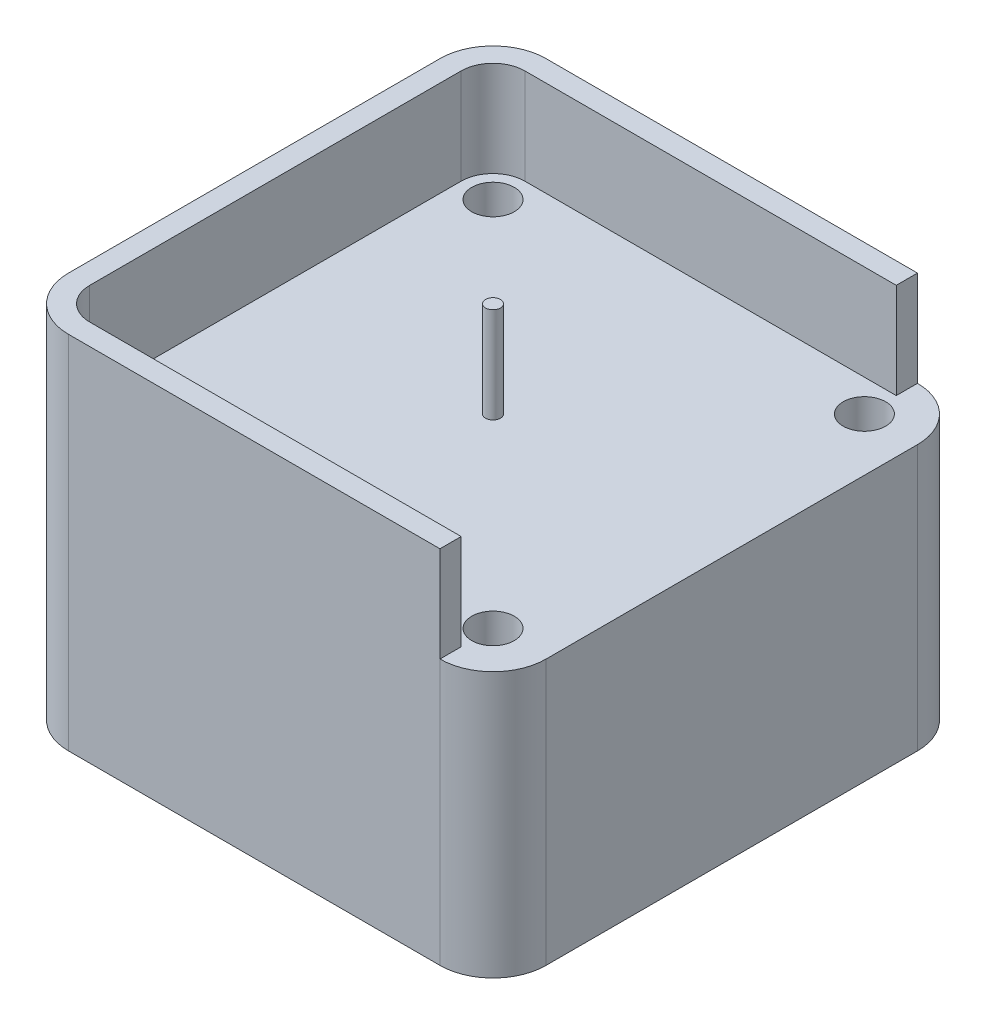
ISO-10303-21;
HEADER;
FILE_DESCRIPTION(('STEP AP214'),'2;1');
FILE_NAME('part.step','',(''),(''),'','','');
FILE_SCHEMA(('AUTOMOTIVE_DESIGN { 1 0 10303 214 1 1 1 1 }'));
ENDSEC;
DATA;
#1=APPLICATION_CONTEXT('core data for automotive mechanical design processes');
#2=APPLICATION_PROTOCOL_DEFINITION('international standard','automotive_design',2000,#1);
#3=PRODUCT_CONTEXT('',#1,'mechanical');
#4=PRODUCT('Part','Part','',(#3));
#5=PRODUCT_RELATED_PRODUCT_CATEGORY('part','',(#4));
#6=PRODUCT_DEFINITION_FORMATION('','',#4);
#7=PRODUCT_DEFINITION_CONTEXT('part definition',#1,'design');
#8=PRODUCT_DEFINITION('design','',#6,#7);
#9=PRODUCT_DEFINITION_SHAPE('','',#8);
#10=(LENGTH_UNIT() NAMED_UNIT(*) SI_UNIT(.MILLI.,.METRE.));
#11=(NAMED_UNIT(*) PLANE_ANGLE_UNIT() SI_UNIT($,.RADIAN.));
#12=(NAMED_UNIT(*) SI_UNIT($,.STERADIAN.) SOLID_ANGLE_UNIT());
#13=UNCERTAINTY_MEASURE_WITH_UNIT(LENGTH_MEASURE(1.E-05),#10,'distance_accuracy_value','');
#14=(GEOMETRIC_REPRESENTATION_CONTEXT(3) GLOBAL_UNCERTAINTY_ASSIGNED_CONTEXT((#13)) GLOBAL_UNIT_ASSIGNED_CONTEXT((#10,
#11,#12)) REPRESENTATION_CONTEXT('',''));
#15=CARTESIAN_POINT('',(0.,0.,0.));
#16=DIRECTION('',(0.,0.,1.));
#17=DIRECTION('',(1.,0.,0.));
#18=AXIS2_PLACEMENT_3D('',#15,#16,#17);
#19=CARTESIAN_POINT('',(16.1102106969206,50.,-43.2414910858995));
#20=DIRECTION('',(0.,-1.,0.));
#21=DIRECTION('',(0.,0.,-1.));
#22=AXIS2_PLACEMENT_3D('',#19,#20,#21);
#23=CYLINDRICAL_SURFACE('',#22,10.);
#24=CARTESIAN_POINT('',(16.1102106969206,50.,-43.2414910858995));
#25=DIRECTION('',(0.,1.,0.));
#26=DIRECTION('',(0.,0.,1.));
#27=AXIS2_PLACEMENT_3D('',#24,#25,#26);
#28=CIRCLE('',#27,10.);
#29=CARTESIAN_POINT('',(26.1102106969206,50.,-43.2414910858994));
#30=VERTEX_POINT('',#29);
#31=CARTESIAN_POINT('',(16.1102106969206,50.,-53.2414910858995));
#32=VERTEX_POINT('',#31);
#33=EDGE_CURVE('E198',#30,#32,#28,.T.);
#34=ORIENTED_EDGE('',*,*,#33,.F.);
#35=DIRECTION('',(0.,-1.,0.));
#36=VECTOR('',#35,1.);
#37=CARTESIAN_POINT('',(26.1102106969206,50.,-43.2414910858994));
#38=LINE('',#37,#36);
#39=CARTESIAN_POINT('',(26.1102106969206,0.,-43.2414910858994));
#40=VERTEX_POINT('',#39);
#41=EDGE_CURVE('E105',#30,#40,#38,.T.);
#42=ORIENTED_EDGE('',*,*,#41,.T.);
#43=CARTESIAN_POINT('',(16.1102106969206,0.,-43.2414910858995));
#44=DIRECTION('',(0.,1.,0.));
#45=DIRECTION('',(0.,0.,-1.));
#46=AXIS2_PLACEMENT_3D('',#43,#44,#45);
#47=CIRCLE('',#46,10.);
#48=CARTESIAN_POINT('',(16.1102106969205,0.,-53.2414910858995));
#49=VERTEX_POINT('',#48);
#50=EDGE_CURVE('E222',#40,#49,#47,.T.);
#51=ORIENTED_EDGE('',*,*,#50,.T.);
#52=DIRECTION('',(0.,-1.,0.));
#53=VECTOR('',#52,1.);
#54=CARTESIAN_POINT('',(16.1102106969205,50.,-53.2414910858995));
#55=LINE('',#54,#53);
#56=EDGE_CURVE('E220',#32,#49,#55,.T.);
#57=ORIENTED_EDGE('',*,*,#56,.F.);
#58=EDGE_LOOP('',(#34,#42,#51,#57));
#59=FACE_BOUND('',#58,.T.);
#60=ADVANCED_FACE('F90',(#59),#23,.T.);
#61=CARTESIAN_POINT('',(16.1102106969206,50.,26.7585089141005));
#62=DIRECTION('',(0.,-1.,0.));
#63=DIRECTION('',(0.,0.,-1.));
#64=AXIS2_PLACEMENT_3D('',#61,#62,#63);
#65=CYLINDRICAL_SURFACE('',#64,10.);
#66=CARTESIAN_POINT('',(16.1102106969206,50.,26.7585089141005));
#67=DIRECTION('',(0.,1.,0.));
#68=DIRECTION('',(0.,0.,1.));
#69=AXIS2_PLACEMENT_3D('',#66,#67,#68);
#70=CIRCLE('',#69,10.);
#71=CARTESIAN_POINT('',(16.1102106969205,50.,36.7585089141005));
#72=VERTEX_POINT('',#71);
#73=CARTESIAN_POINT('',(26.1102106969206,50.,26.7585089141005));
#74=VERTEX_POINT('',#73);
#75=EDGE_CURVE('E209',#72,#74,#70,.T.);
#76=ORIENTED_EDGE('',*,*,#75,.F.);
#77=DIRECTION('',(0.,-1.,0.));
#78=VECTOR('',#77,1.);
#79=CARTESIAN_POINT('',(16.1102106969205,50.,36.7585089141005));
#80=LINE('',#79,#78);
#81=CARTESIAN_POINT('',(16.1102106969205,0.,36.7585089141005));
#82=VERTEX_POINT('',#81);
#83=EDGE_CURVE('E252',#72,#82,#80,.T.);
#84=ORIENTED_EDGE('',*,*,#83,.T.);
#85=CARTESIAN_POINT('',(16.1102106969206,0.,26.7585089141005));
#86=DIRECTION('',(0.,1.,0.));
#87=DIRECTION('',(0.,0.,1.));
#88=AXIS2_PLACEMENT_3D('',#85,#86,#87);
#89=CIRCLE('',#88,10.);
#90=CARTESIAN_POINT('',(26.1102106969206,0.,26.7585089141004));
#91=VERTEX_POINT('',#90);
#92=EDGE_CURVE('E260',#82,#91,#89,.T.);
#93=ORIENTED_EDGE('',*,*,#92,.T.);
#94=DIRECTION('',(0.,-1.,0.));
#95=VECTOR('',#94,1.);
#96=CARTESIAN_POINT('',(26.1102106969206,50.,26.7585089141004));
#97=LINE('',#96,#95);
#98=EDGE_CURVE('E112',#74,#91,#97,.T.);
#99=ORIENTED_EDGE('',*,*,#98,.F.);
#100=EDGE_LOOP('',(#76,#84,#93,#99));
#101=FACE_BOUND('',#100,.T.);
#102=ADVANCED_FACE('F436',(#101),#65,.T.);
#103=CARTESIAN_POINT('',(16.1102106969206,50.,-43.2414910858995));
#104=DIRECTION('',(0.,-1.,0.));
#105=DIRECTION('',(0.,0.,-1.));
#106=AXIS2_PLACEMENT_3D('',#103,#104,#105);
#107=PLANE('',#106);
#108=DIRECTION('',(0.,0.,1.));
#109=VECTOR('',#108,1.);
#110=CARTESIAN_POINT('',(16.1102106969206,50.,-53.2414910858995));
#111=LINE('',#110,#109);
#112=CARTESIAN_POINT('',(16.1102106969206,50.,-49.2414910858995));
#113=VERTEX_POINT('',#112);
#114=EDGE_CURVE('E203',#32,#113,#111,.T.);
#115=ORIENTED_EDGE('',*,*,#114,.T.);
#116=DIRECTION('',(-1.,0.,0.));
#117=VECTOR('',#116,1.);
#118=CARTESIAN_POINT('',(16.1102106969206,50.,-49.2414910858995));
#119=LINE('',#118,#117);
#120=CARTESIAN_POINT('',(-53.8897893030793,50.,-49.2414910858995));
#121=VERTEX_POINT('',#120);
#122=EDGE_CURVE('E367',#113,#121,#119,.T.);
#123=ORIENTED_EDGE('',*,*,#122,.T.);
#124=CARTESIAN_POINT('',(-53.8897893030794,50.,-43.2414910858995));
#125=DIRECTION('',(0.,1.,0.));
#126=DIRECTION('',(0.,0.,1.));
#127=AXIS2_PLACEMENT_3D('',#124,#125,#126);
#128=CIRCLE('',#127,6.);
#129=CARTESIAN_POINT('',(-59.8897893030794,50.,-43.2414910858994));
#130=VERTEX_POINT('',#129);
#131=EDGE_CURVE('E363',#121,#130,#128,.T.);
#132=ORIENTED_EDGE('',*,*,#131,.T.);
#133=DIRECTION('',(0.,0.,1.));
#134=VECTOR('',#133,1.);
#135=CARTESIAN_POINT('',(-59.8897893030794,50.,-43.2414910858994));
#136=LINE('',#135,#134);
#137=CARTESIAN_POINT('',(-59.8897893030794,50.,26.7585089141004));
#138=VERTEX_POINT('',#137);
#139=EDGE_CURVE('E359',#130,#138,#136,.T.);
#140=ORIENTED_EDGE('',*,*,#139,.T.);
#141=CARTESIAN_POINT('',(-53.8897893030794,50.,26.7585089141005));
#142=DIRECTION('',(0.,1.,0.));
#143=DIRECTION('',(0.,0.,1.));
#144=AXIS2_PLACEMENT_3D('',#141,#142,#143);
#145=CIRCLE('',#144,5.99999999999999);
#146=CARTESIAN_POINT('',(-53.8897893030794,50.,32.7585089141005));
#147=VERTEX_POINT('',#146);
#148=EDGE_CURVE('E355',#138,#147,#145,.T.);
#149=ORIENTED_EDGE('',*,*,#148,.T.);
#150=DIRECTION('',(1.,0.,0.));
#151=VECTOR('',#150,1.);
#152=CARTESIAN_POINT('',(-53.8897893030794,50.,32.7585089141005));
#153=LINE('',#152,#151);
#154=CARTESIAN_POINT('',(16.1102106969205,50.,32.7585089141005));
#155=VERTEX_POINT('',#154);
#156=EDGE_CURVE('E350',#147,#155,#153,.T.);
#157=ORIENTED_EDGE('',*,*,#156,.T.);
#158=DIRECTION('',(0.,0.,1.));
#159=VECTOR('',#158,1.);
#160=CARTESIAN_POINT('',(16.1102106969205,50.,36.7585089141005));
#161=LINE('',#160,#159);
#162=EDGE_CURVE('E392',#155,#72,#161,.T.);
#163=ORIENTED_EDGE('',*,*,#162,.T.);
#164=ORIENTED_EDGE('',*,*,#75,.T.);
#165=DIRECTION('',(0.,0.,1.));
#166=VECTOR('',#165,1.);
#167=CARTESIAN_POINT('',(26.1102106969206,50.,-43.2414910858994));
#168=LINE('',#167,#166);
#169=EDGE_CURVE('E206',#30,#74,#168,.T.);
#170=ORIENTED_EDGE('',*,*,#169,.F.);
#171=ORIENTED_EDGE('',*,*,#33,.T.);
#172=EDGE_LOOP('',(#115,#123,#132,#140,#149,#157,#163,#164,#170,#171));
#173=FACE_BOUND('',#172,.T.);
#174=CARTESIAN_POINT('',(16.1102106969213,50.,26.7585089141005));
#175=DIRECTION('',(0.,1.,0.));
#176=DIRECTION('',(0.,0.,1.));
#177=AXIS2_PLACEMENT_3D('',#174,#175,#176);
#178=CIRCLE('',#177,4.);
#179=CARTESIAN_POINT('',(16.1102106969213,50.,30.7585089141005));
#180=VERTEX_POINT('',#179);
#181=EDGE_CURVE('E294',#180,#180,#178,.T.);
#182=ORIENTED_EDGE('',*,*,#181,.F.);
#183=EDGE_LOOP('',(#182));
#184=FACE_BOUND('',#183,.T.);
#185=CARTESIAN_POINT('',(-18.8897893030794,50.,-8.24149108589948));
#186=DIRECTION('',(0.,-1.,0.));
#187=DIRECTION('',(0.,0.,-1.));
#188=AXIS2_PLACEMENT_3D('',#185,#186,#187);
#189=CIRCLE('',#188,1.4);
#190=CARTESIAN_POINT('',(-18.8897893030794,50.,-9.64149108589948));
#191=VERTEX_POINT('',#190);
#192=EDGE_CURVE('E12',#191,#191,#189,.F.);
#193=ORIENTED_EDGE('',*,*,#192,.F.);
#194=EDGE_LOOP('',(#193));
#195=FACE_BOUND('',#194,.T.);
#196=CARTESIAN_POINT('',(-53.8897893030794,50.,-43.2414910858995));
#197=DIRECTION('',(0.,1.,0.));
#198=DIRECTION('',(0.,0.,1.));
#199=AXIS2_PLACEMENT_3D('',#196,#197,#198);
#200=CIRCLE('',#199,4.);
#201=CARTESIAN_POINT('',(-53.8897893030794,50.,-39.2414910858995));
#202=VERTEX_POINT('',#201);
#203=EDGE_CURVE('E281',#202,#202,#200,.T.);
#204=ORIENTED_EDGE('',*,*,#203,.F.);
#205=EDGE_LOOP('',(#204));
#206=FACE_BOUND('',#205,.T.);
#207=CARTESIAN_POINT('',(16.1102106969206,50.,-43.2414910858995));
#208=DIRECTION('',(0.,1.,0.));
#209=DIRECTION('',(0.,0.,1.));
#210=AXIS2_PLACEMENT_3D('',#207,#208,#209);
#211=CIRCLE('',#210,4.);
#212=CARTESIAN_POINT('',(16.1102106969206,50.,-39.2414910858995));
#213=VERTEX_POINT('',#212);
#214=EDGE_CURVE('E286',#213,#213,#211,.T.);
#215=ORIENTED_EDGE('',*,*,#214,.F.);
#216=EDGE_LOOP('',(#215));
#217=FACE_BOUND('',#216,.T.);
#218=CARTESIAN_POINT('',(-53.8897893030787,50.,26.7585089141005));
#219=DIRECTION('',(0.,1.,0.));
#220=DIRECTION('',(0.,0.,1.));
#221=AXIS2_PLACEMENT_3D('',#218,#219,#220);
#222=CIRCLE('',#221,4.);
#223=CARTESIAN_POINT('',(-53.8897893030787,50.,30.7585089141005));
#224=VERTEX_POINT('',#223);
#225=EDGE_CURVE('E302',#224,#224,#222,.T.);
#226=ORIENTED_EDGE('',*,*,#225,.F.);
#227=EDGE_LOOP('',(#226));
#228=FACE_BOUND('',#227,.T.);
#229=ADVANCED_FACE('F200',(#173,#184,#195,#206,#217,#228),#107,.F.);
#230=CARTESIAN_POINT('',(16.1102106969206,0.,-43.2414910858995));
#231=DIRECTION('',(0.,-1.,0.));
#232=DIRECTION('',(0.,0.,-1.));
#233=AXIS2_PLACEMENT_3D('',#230,#231,#232);
#234=PLANE('',#233);
#235=CARTESIAN_POINT('',(16.1102106969213,0.,26.7585089141005));
#236=DIRECTION('',(0.,1.,0.));
#237=DIRECTION('',(0.,0.,1.));
#238=AXIS2_PLACEMENT_3D('',#235,#236,#237);
#239=CIRCLE('',#238,4.);
#240=CARTESIAN_POINT('',(16.1102106969213,0.,30.7585089141005));
#241=VERTEX_POINT('',#240);
#242=EDGE_CURVE('E298',#241,#241,#239,.T.);
#243=ORIENTED_EDGE('',*,*,#242,.T.);
#244=EDGE_LOOP('',(#243));
#245=FACE_BOUND('',#244,.T.);
#246=CARTESIAN_POINT('',(-53.8897893030794,0.,-43.2414910858995));
#247=DIRECTION('',(0.,1.,0.));
#248=DIRECTION('',(0.,0.,1.));
#249=AXIS2_PLACEMENT_3D('',#246,#247,#248);
#250=CIRCLE('',#249,4.);
#251=CARTESIAN_POINT('',(-53.8897893030794,0.,-39.2414910858995));
#252=VERTEX_POINT('',#251);
#253=EDGE_CURVE('E282',#252,#252,#250,.T.);
#254=ORIENTED_EDGE('',*,*,#253,.T.);
#255=EDGE_LOOP('',(#254));
#256=FACE_BOUND('',#255,.T.);
#257=ORIENTED_EDGE('',*,*,#50,.F.);
#258=DIRECTION('',(0.,0.,-1.));
#259=VECTOR('',#258,1.);
#260=CARTESIAN_POINT('',(26.1102106969206,0.,-43.2414910858994));
#261=LINE('',#260,#259);
#262=EDGE_CURVE('E257',#91,#40,#261,.T.);
#263=ORIENTED_EDGE('',*,*,#262,.F.);
#264=ORIENTED_EDGE('',*,*,#92,.F.);
#265=DIRECTION('',(1.,0.,0.));
#266=VECTOR('',#265,1.);
#267=CARTESIAN_POINT('',(-53.8897893030793,0.,36.7585089141005));
#268=LINE('',#267,#266);
#269=CARTESIAN_POINT('',(-53.8897893030794,0.,36.7585089141005));
#270=VERTEX_POINT('',#269);
#271=EDGE_CURVE('E263',#270,#82,#268,.T.);
#272=ORIENTED_EDGE('',*,*,#271,.F.);
#273=CARTESIAN_POINT('',(-53.8897893030794,0.,26.7585089141005));
#274=DIRECTION('',(0.,1.,0.));
#275=DIRECTION('',(0.,0.,1.));
#276=AXIS2_PLACEMENT_3D('',#273,#274,#275);
#277=CIRCLE('',#276,10.);
#278=CARTESIAN_POINT('',(-63.8897893030794,0.,26.7585089141004));
#279=VERTEX_POINT('',#278);
#280=EDGE_CURVE('E267',#279,#270,#277,.T.);
#281=ORIENTED_EDGE('',*,*,#280,.F.);
#282=DIRECTION('',(0.,0.,1.));
#283=VECTOR('',#282,1.);
#284=CARTESIAN_POINT('',(-63.8897893030794,0.,-43.2414910858994));
#285=LINE('',#284,#283);
#286=CARTESIAN_POINT('',(-63.8897893030794,0.,-43.2414910858994));
#287=VERTEX_POINT('',#286);
#288=EDGE_CURVE('E270',#287,#279,#285,.T.);
#289=ORIENTED_EDGE('',*,*,#288,.F.);
#290=CARTESIAN_POINT('',(-53.8897893030794,0.,-43.2414910858995));
#291=DIRECTION('',(0.,1.,0.));
#292=DIRECTION('',(0.,0.,1.));
#293=AXIS2_PLACEMENT_3D('',#290,#291,#292);
#294=CIRCLE('',#293,10.);
#295=CARTESIAN_POINT('',(-53.8897893030793,0.,-53.2414910858995));
#296=VERTEX_POINT('',#295);
#297=EDGE_CURVE('E273',#296,#287,#294,.T.);
#298=ORIENTED_EDGE('',*,*,#297,.F.);
#299=DIRECTION('',(-1.,0.,0.));
#300=VECTOR('',#299,1.);
#301=CARTESIAN_POINT('',(-53.8897893030793,0.,-53.2414910858995));
#302=LINE('',#301,#300);
#303=EDGE_CURVE('E276',#49,#296,#302,.T.);
#304=ORIENTED_EDGE('',*,*,#303,.F.);
#305=EDGE_LOOP('',(#257,#263,#264,#272,#281,#289,#298,#304));
#306=FACE_BOUND('',#305,.T.);
#307=CARTESIAN_POINT('',(16.1102106969206,0.,-43.2414910858995));
#308=DIRECTION('',(0.,1.,0.));
#309=DIRECTION('',(0.,0.,1.));
#310=AXIS2_PLACEMENT_3D('',#307,#308,#309);
#311=CIRCLE('',#310,4.);
#312=CARTESIAN_POINT('',(16.1102106969206,0.,-39.2414910858995));
#313=VERTEX_POINT('',#312);
#314=EDGE_CURVE('E290',#313,#313,#311,.T.);
#315=ORIENTED_EDGE('',*,*,#314,.T.);
#316=EDGE_LOOP('',(#315));
#317=FACE_BOUND('',#316,.T.);
#318=CARTESIAN_POINT('',(-53.8897893030787,0.,26.7585089141005));
#319=DIRECTION('',(0.,1.,0.));
#320=DIRECTION('',(0.,0.,1.));
#321=AXIS2_PLACEMENT_3D('',#318,#319,#320);
#322=CIRCLE('',#321,4.);
#323=CARTESIAN_POINT('',(-53.8897893030787,0.,30.7585089141005));
#324=VERTEX_POINT('',#323);
#325=EDGE_CURVE('E306',#324,#324,#322,.T.);
#326=ORIENTED_EDGE('',*,*,#325,.T.);
#327=EDGE_LOOP('',(#326));
#328=FACE_BOUND('',#327,.T.);
#329=ADVANCED_FACE('F440',(#245,#256,#306,#317,#328),#234,.T.);
#330=CARTESIAN_POINT('',(-53.8897893030793,50.,-53.2414910858995));
#331=DIRECTION('',(0.,0.,1.));
#332=DIRECTION('',(1.,0.,0.));
#333=AXIS2_PLACEMENT_3D('',#330,#331,#332);
#334=PLANE('',#333);
#335=ORIENTED_EDGE('',*,*,#303,.T.);
#336=DIRECTION('',(0.,-1.,0.));
#337=VECTOR('',#336,1.);
#338=CARTESIAN_POINT('',(-53.8897893030793,50.,-53.2414910858995));
#339=LINE('',#338,#337);
#340=CARTESIAN_POINT('',(-53.8897893030793,68.,-53.2414910858995));
#341=VERTEX_POINT('',#340);
#342=EDGE_CURVE('E226',#341,#296,#339,.T.);
#343=ORIENTED_EDGE('',*,*,#342,.F.);
#344=DIRECTION('',(-1.,0.,0.));
#345=VECTOR('',#344,1.);
#346=CARTESIAN_POINT('',(16.1102106969206,68.,-53.2414910858995));
#347=LINE('',#346,#345);
#348=CARTESIAN_POINT('',(16.1102106969206,68.,-53.2414910858995));
#349=VERTEX_POINT('',#348);
#350=EDGE_CURVE('E230',#349,#341,#347,.T.);
#351=ORIENTED_EDGE('',*,*,#350,.F.);
#352=EDGE_CURVE('E98',#349,#32,#55,.T.);
#353=ORIENTED_EDGE('',*,*,#352,.T.);
#354=ORIENTED_EDGE('',*,*,#56,.T.);
#355=EDGE_LOOP('',(#335,#343,#351,#353,#354));
#356=FACE_BOUND('',#355,.T.);
#357=ADVANCED_FACE('F228',(#356),#334,.F.);
#358=CARTESIAN_POINT('',(-53.8897893030794,50.,-43.2414910858995));
#359=DIRECTION('',(0.,-1.,0.));
#360=DIRECTION('',(0.,0.,-1.));
#361=AXIS2_PLACEMENT_3D('',#358,#359,#360);
#362=CYLINDRICAL_SURFACE('',#361,10.);
#363=ORIENTED_EDGE('',*,*,#297,.T.);
#364=DIRECTION('',(0.,-1.,0.));
#365=VECTOR('',#364,1.);
#366=CARTESIAN_POINT('',(-63.8897893030794,50.,-43.2414910858994));
#367=LINE('',#366,#365);
#368=CARTESIAN_POINT('',(-63.8897893030794,68.,-43.2414910858994));
#369=VERTEX_POINT('',#368);
#370=EDGE_CURVE('E236',#369,#287,#367,.T.);
#371=ORIENTED_EDGE('',*,*,#370,.F.);
#372=CARTESIAN_POINT('',(-53.8897893030794,68.,-43.2414910858995));
#373=DIRECTION('',(0.,1.,0.));
#374=DIRECTION('',(1.,0.,0.));
#375=AXIS2_PLACEMENT_3D('',#372,#373,#374);
#376=CIRCLE('',#375,10.);
#377=EDGE_CURVE('E325',#341,#369,#376,.T.);
#378=ORIENTED_EDGE('',*,*,#377,.F.);
#379=ORIENTED_EDGE('',*,*,#342,.T.);
#380=EDGE_LOOP('',(#363,#371,#378,#379));
#381=FACE_BOUND('',#380,.T.);
#382=ADVANCED_FACE('F475',(#381),#362,.T.);
#383=CARTESIAN_POINT('',(-63.8897893030794,50.,-43.2414910858994));
#384=DIRECTION('',(1.,0.,0.));
#385=DIRECTION('',(0.,0.,-1.));
#386=AXIS2_PLACEMENT_3D('',#383,#384,#385);
#387=PLANE('',#386);
#388=ORIENTED_EDGE('',*,*,#288,.T.);
#389=DIRECTION('',(0.,-1.,0.));
#390=VECTOR('',#389,1.);
#391=CARTESIAN_POINT('',(-63.8897893030794,50.,26.7585089141004));
#392=LINE('',#391,#390);
#393=CARTESIAN_POINT('',(-63.8897893030794,68.,26.7585089141004));
#394=VERTEX_POINT('',#393);
#395=EDGE_CURVE('E240',#394,#279,#392,.T.);
#396=ORIENTED_EDGE('',*,*,#395,.F.);
#397=DIRECTION('',(0.,0.,1.));
#398=VECTOR('',#397,1.);
#399=CARTESIAN_POINT('',(-63.8897893030794,68.,-43.2414910858994));
#400=LINE('',#399,#398);
#401=EDGE_CURVE('E321',#369,#394,#400,.T.);
#402=ORIENTED_EDGE('',*,*,#401,.F.);
#403=ORIENTED_EDGE('',*,*,#370,.T.);
#404=EDGE_LOOP('',(#388,#396,#402,#403));
#405=FACE_BOUND('',#404,.T.);
#406=ADVANCED_FACE('F471',(#405),#387,.F.);
#407=CARTESIAN_POINT('',(-53.8897893030794,50.,26.7585089141005));
#408=DIRECTION('',(0.,-1.,0.));
#409=DIRECTION('',(0.,0.,-1.));
#410=AXIS2_PLACEMENT_3D('',#407,#408,#409);
#411=CYLINDRICAL_SURFACE('',#410,10.);
#412=ORIENTED_EDGE('',*,*,#280,.T.);
#413=DIRECTION('',(0.,-1.,0.));
#414=VECTOR('',#413,1.);
#415=CARTESIAN_POINT('',(-53.8897893030794,50.,36.7585089141005));
#416=LINE('',#415,#414);
#417=CARTESIAN_POINT('',(-53.8897893030794,68.,36.7585089141005));
#418=VERTEX_POINT('',#417);
#419=EDGE_CURVE('E244',#418,#270,#416,.T.);
#420=ORIENTED_EDGE('',*,*,#419,.F.);
#421=CARTESIAN_POINT('',(-53.8897893030794,68.,26.7585089141005));
#422=DIRECTION('',(0.,1.,0.));
#423=DIRECTION('',(1.,0.,0.));
#424=AXIS2_PLACEMENT_3D('',#421,#422,#423);
#425=CIRCLE('',#424,9.99999999999999);
#426=EDGE_CURVE('E317',#394,#418,#425,.T.);
#427=ORIENTED_EDGE('',*,*,#426,.F.);
#428=ORIENTED_EDGE('',*,*,#395,.T.);
#429=EDGE_LOOP('',(#412,#420,#427,#428));
#430=FACE_BOUND('',#429,.T.);
#431=ADVANCED_FACE('F454',(#430),#411,.T.);
#432=CARTESIAN_POINT('',(-53.8897893030793,50.,36.7585089141005));
#433=DIRECTION('',(0.,0.,-1.));
#434=DIRECTION('',(-1.,0.,0.));
#435=AXIS2_PLACEMENT_3D('',#432,#433,#434);
#436=PLANE('',#435);
#437=ORIENTED_EDGE('',*,*,#271,.T.);
#438=ORIENTED_EDGE('',*,*,#83,.F.);
#439=CARTESIAN_POINT('',(16.1102106969205,68.,36.7585089141005));
#440=VERTEX_POINT('',#439);
#441=EDGE_CURVE('E248',#440,#72,#80,.T.);
#442=ORIENTED_EDGE('',*,*,#441,.F.);
#443=DIRECTION('',(1.,0.,0.));
#444=VECTOR('',#443,1.);
#445=CARTESIAN_POINT('',(-53.8897893030794,68.,36.7585089141005));
#446=LINE('',#445,#444);
#447=EDGE_CURVE('E310',#418,#440,#446,.T.);
#448=ORIENTED_EDGE('',*,*,#447,.F.);
#449=ORIENTED_EDGE('',*,*,#419,.T.);
#450=EDGE_LOOP('',(#437,#438,#442,#448,#449));
#451=FACE_BOUND('',#450,.T.);
#452=ADVANCED_FACE('F431',(#451),#436,.F.);
#453=CARTESIAN_POINT('',(26.1102106969206,50.,-43.2414910858994));
#454=DIRECTION('',(-1.,0.,0.));
#455=DIRECTION('',(0.,0.,1.));
#456=AXIS2_PLACEMENT_3D('',#453,#454,#455);
#457=PLANE('',#456);
#458=ORIENTED_EDGE('',*,*,#41,.F.);
#459=ORIENTED_EDGE('',*,*,#169,.T.);
#460=ORIENTED_EDGE('',*,*,#98,.T.);
#461=ORIENTED_EDGE('',*,*,#262,.T.);
#462=EDGE_LOOP('',(#458,#459,#460,#461));
#463=FACE_BOUND('',#462,.T.);
#464=ADVANCED_FACE('F442',(#463),#457,.F.);
#465=CARTESIAN_POINT('',(-53.8897893030794,50.,-43.2414910858995));
#466=DIRECTION('',(0.,-1.,0.));
#467=DIRECTION('',(0.,0.,-1.));
#468=AXIS2_PLACEMENT_3D('',#465,#466,#467);
#469=CYLINDRICAL_SURFACE('',#468,4.);
#470=ORIENTED_EDGE('',*,*,#203,.T.);
#471=EDGE_LOOP('',(#470));
#472=FACE_BOUND('',#471,.T.);
#473=ORIENTED_EDGE('',*,*,#253,.F.);
#474=EDGE_LOOP('',(#473));
#475=FACE_BOUND('',#474,.T.);
#476=ADVANCED_FACE('F444',(#472,#475),#469,.F.);
#477=CARTESIAN_POINT('',(16.1102106969206,50.,-43.2414910858995));
#478=DIRECTION('',(0.,-1.,0.));
#479=DIRECTION('',(0.,0.,-1.));
#480=AXIS2_PLACEMENT_3D('',#477,#478,#479);
#481=CYLINDRICAL_SURFACE('',#480,4.);
#482=ORIENTED_EDGE('',*,*,#214,.T.);
#483=EDGE_LOOP('',(#482));
#484=FACE_BOUND('',#483,.T.);
#485=ORIENTED_EDGE('',*,*,#314,.F.);
#486=EDGE_LOOP('',(#485));
#487=FACE_BOUND('',#486,.T.);
#488=ADVANCED_FACE('F451',(#484,#487),#481,.F.);
#489=CARTESIAN_POINT('',(16.1102106969213,50.,26.7585089141005));
#490=DIRECTION('',(0.,-1.,0.));
#491=DIRECTION('',(0.,0.,-1.));
#492=AXIS2_PLACEMENT_3D('',#489,#490,#491);
#493=CYLINDRICAL_SURFACE('',#492,4.);
#494=ORIENTED_EDGE('',*,*,#181,.T.);
#495=EDGE_LOOP('',(#494));
#496=FACE_BOUND('',#495,.T.);
#497=ORIENTED_EDGE('',*,*,#242,.F.);
#498=EDGE_LOOP('',(#497));
#499=FACE_BOUND('',#498,.T.);
#500=ADVANCED_FACE('F489',(#496,#499),#493,.F.);
#501=CARTESIAN_POINT('',(-53.8897893030787,50.,26.7585089141005));
#502=DIRECTION('',(0.,-1.,0.));
#503=DIRECTION('',(0.,0.,-1.));
#504=AXIS2_PLACEMENT_3D('',#501,#502,#503);
#505=CYLINDRICAL_SURFACE('',#504,4.);
#506=ORIENTED_EDGE('',*,*,#225,.T.);
#507=EDGE_LOOP('',(#506));
#508=FACE_BOUND('',#507,.T.);
#509=ORIENTED_EDGE('',*,*,#325,.F.);
#510=EDGE_LOOP('',(#509));
#511=FACE_BOUND('',#510,.T.);
#512=ADVANCED_FACE('F493',(#508,#511),#505,.F.);
#513=CARTESIAN_POINT('',(16.1102106969206,68.,-43.2414910858995));
#514=DIRECTION('',(0.,1.,0.));
#515=DIRECTION('',(0.,0.,1.));
#516=AXIS2_PLACEMENT_3D('',#513,#514,#515);
#517=PLANE('',#516);
#518=DIRECTION('',(0.,0.,1.));
#519=VECTOR('',#518,1.);
#520=CARTESIAN_POINT('',(16.1102106969206,68.,-53.2414910858995));
#521=LINE('',#520,#519);
#522=CARTESIAN_POINT('',(16.1102106969206,68.,-49.2414910858995));
#523=VERTEX_POINT('',#522);
#524=EDGE_CURVE('E218',#349,#523,#521,.T.);
#525=ORIENTED_EDGE('',*,*,#524,.F.);
#526=ORIENTED_EDGE('',*,*,#350,.T.);
#527=ORIENTED_EDGE('',*,*,#377,.T.);
#528=ORIENTED_EDGE('',*,*,#401,.T.);
#529=ORIENTED_EDGE('',*,*,#426,.T.);
#530=ORIENTED_EDGE('',*,*,#447,.T.);
#531=DIRECTION('',(0.,0.,1.));
#532=VECTOR('',#531,1.);
#533=CARTESIAN_POINT('',(16.1102106969205,68.,36.7585089141005));
#534=LINE('',#533,#532);
#535=CARTESIAN_POINT('',(16.1102106969205,68.,32.7585089141005));
#536=VERTEX_POINT('',#535);
#537=EDGE_CURVE('E395',#536,#440,#534,.T.);
#538=ORIENTED_EDGE('',*,*,#537,.F.);
#539=DIRECTION('',(1.,0.,0.));
#540=VECTOR('',#539,1.);
#541=CARTESIAN_POINT('',(-53.8897893030794,68.,32.7585089141005));
#542=LINE('',#541,#540);
#543=CARTESIAN_POINT('',(-53.8897893030794,68.,32.7585089141005));
#544=VERTEX_POINT('',#543);
#545=EDGE_CURVE('E349',#544,#536,#542,.T.);
#546=ORIENTED_EDGE('',*,*,#545,.F.);
#547=CARTESIAN_POINT('',(-53.8897893030794,68.,26.7585089141005));
#548=DIRECTION('',(0.,1.,0.));
#549=DIRECTION('',(0.,0.,1.));
#550=AXIS2_PLACEMENT_3D('',#547,#548,#549);
#551=CIRCLE('',#550,5.99999999999999);
#552=CARTESIAN_POINT('',(-59.8897893030794,68.,26.7585089141004));
#553=VERTEX_POINT('',#552);
#554=EDGE_CURVE('E374',#553,#544,#551,.T.);
#555=ORIENTED_EDGE('',*,*,#554,.F.);
#556=DIRECTION('',(0.,0.,1.));
#557=VECTOR('',#556,1.);
#558=CARTESIAN_POINT('',(-59.8897893030794,68.,-43.2414910858994));
#559=LINE('',#558,#557);
#560=CARTESIAN_POINT('',(-59.8897893030794,68.,-43.2414910858994));
#561=VERTEX_POINT('',#560);
#562=EDGE_CURVE('E377',#561,#553,#559,.T.);
#563=ORIENTED_EDGE('',*,*,#562,.F.);
#564=CARTESIAN_POINT('',(-53.8897893030794,68.,-43.2414910858995));
#565=DIRECTION('',(0.,1.,0.));
#566=DIRECTION('',(0.,0.,1.));
#567=AXIS2_PLACEMENT_3D('',#564,#565,#566);
#568=CIRCLE('',#567,6.);
#569=CARTESIAN_POINT('',(-53.8897893030793,68.,-49.2414910858995));
#570=VERTEX_POINT('',#569);
#571=EDGE_CURVE('E380',#570,#561,#568,.T.);
#572=ORIENTED_EDGE('',*,*,#571,.F.);
#573=DIRECTION('',(-1.,0.,0.));
#574=VECTOR('',#573,1.);
#575=CARTESIAN_POINT('',(16.1102106969206,68.,-49.2414910858995));
#576=LINE('',#575,#574);
#577=EDGE_CURVE('E354',#523,#570,#576,.T.);
#578=ORIENTED_EDGE('',*,*,#577,.F.);
#579=EDGE_LOOP('',(#525,#526,#527,#528,#529,#530,#538,#546,#555,#563,#572,#578));
#580=FACE_BOUND('',#579,.T.);
#581=ADVANCED_FACE('F405',(#580),#517,.T.);
#582=CARTESIAN_POINT('',(16.1102106969206,68.,-49.2414910858995));
#583=DIRECTION('',(0.,0.,1.));
#584=DIRECTION('',(1.,0.,0.));
#585=AXIS2_PLACEMENT_3D('',#582,#583,#584);
#586=PLANE('',#585);
#587=ORIENTED_EDGE('',*,*,#122,.F.);
#588=DIRECTION('',(0.,-1.,0.));
#589=VECTOR('',#588,1.);
#590=CARTESIAN_POINT('',(16.1102106969206,68.,-49.2414910858995));
#591=LINE('',#590,#589);
#592=EDGE_CURVE('E216',#523,#113,#591,.T.);
#593=ORIENTED_EDGE('',*,*,#592,.F.);
#594=ORIENTED_EDGE('',*,*,#577,.T.);
#595=DIRECTION('',(0.,-1.,0.));
#596=VECTOR('',#595,1.);
#597=CARTESIAN_POINT('',(-53.8897893030793,68.,-49.2414910858995));
#598=LINE('',#597,#596);
#599=EDGE_CURVE('E333',#570,#121,#598,.T.);
#600=ORIENTED_EDGE('',*,*,#599,.T.);
#601=EDGE_LOOP('',(#587,#593,#594,#600));
#602=FACE_BOUND('',#601,.T.);
#603=ADVANCED_FACE('F402',(#602),#586,.T.);
#604=CARTESIAN_POINT('',(-53.8897893030794,68.,-43.2414910858995));
#605=DIRECTION('',(0.,-1.,0.));
#606=DIRECTION('',(0.,0.,-1.));
#607=AXIS2_PLACEMENT_3D('',#604,#605,#606);
#608=CYLINDRICAL_SURFACE('',#607,6.);
#609=ORIENTED_EDGE('',*,*,#131,.F.);
#610=ORIENTED_EDGE('',*,*,#599,.F.);
#611=ORIENTED_EDGE('',*,*,#571,.T.);
#612=DIRECTION('',(0.,-1.,0.));
#613=VECTOR('',#612,1.);
#614=CARTESIAN_POINT('',(-59.8897893030794,68.,-43.2414910858994));
#615=LINE('',#614,#613);
#616=EDGE_CURVE('E336',#561,#130,#615,.T.);
#617=ORIENTED_EDGE('',*,*,#616,.T.);
#618=EDGE_LOOP('',(#609,#610,#611,#617));
#619=FACE_BOUND('',#618,.T.);
#620=ADVANCED_FACE('F411',(#619),#608,.F.);
#621=CARTESIAN_POINT('',(-59.8897893030794,68.,-43.2414910858994));
#622=DIRECTION('',(1.,0.,0.));
#623=DIRECTION('',(0.,0.,-1.));
#624=AXIS2_PLACEMENT_3D('',#621,#622,#623);
#625=PLANE('',#624);
#626=ORIENTED_EDGE('',*,*,#139,.F.);
#627=ORIENTED_EDGE('',*,*,#616,.F.);
#628=ORIENTED_EDGE('',*,*,#562,.T.);
#629=DIRECTION('',(0.,-1.,0.));
#630=VECTOR('',#629,1.);
#631=CARTESIAN_POINT('',(-59.8897893030794,68.,26.7585089141004));
#632=LINE('',#631,#630);
#633=EDGE_CURVE('E339',#553,#138,#632,.T.);
#634=ORIENTED_EDGE('',*,*,#633,.T.);
#635=EDGE_LOOP('',(#626,#627,#628,#634));
#636=FACE_BOUND('',#635,.T.);
#637=ADVANCED_FACE('F414',(#636),#625,.T.);
#638=CARTESIAN_POINT('',(-53.8897893030794,68.,26.7585089141005));
#639=DIRECTION('',(0.,-1.,0.));
#640=DIRECTION('',(0.,0.,-1.));
#641=AXIS2_PLACEMENT_3D('',#638,#639,#640);
#642=CYLINDRICAL_SURFACE('',#641,5.99999999999999);
#643=ORIENTED_EDGE('',*,*,#148,.F.);
#644=ORIENTED_EDGE('',*,*,#633,.F.);
#645=ORIENTED_EDGE('',*,*,#554,.T.);
#646=DIRECTION('',(0.,-1.,0.));
#647=VECTOR('',#646,1.);
#648=CARTESIAN_POINT('',(-53.8897893030794,68.,32.7585089141005));
#649=LINE('',#648,#647);
#650=EDGE_CURVE('E342',#544,#147,#649,.T.);
#651=ORIENTED_EDGE('',*,*,#650,.T.);
#652=EDGE_LOOP('',(#643,#644,#645,#651));
#653=FACE_BOUND('',#652,.T.);
#654=ADVANCED_FACE('F419',(#653),#642,.F.);
#655=CARTESIAN_POINT('',(-53.8897893030794,68.,32.7585089141005));
#656=DIRECTION('',(0.,0.,-1.));
#657=DIRECTION('',(-1.,0.,0.));
#658=AXIS2_PLACEMENT_3D('',#655,#656,#657);
#659=PLANE('',#658);
#660=ORIENTED_EDGE('',*,*,#156,.F.);
#661=ORIENTED_EDGE('',*,*,#650,.F.);
#662=ORIENTED_EDGE('',*,*,#545,.T.);
#663=DIRECTION('',(0.,-1.,0.));
#664=VECTOR('',#663,1.);
#665=CARTESIAN_POINT('',(16.1102106969205,68.,32.7585089141005));
#666=LINE('',#665,#664);
#667=EDGE_CURVE('E345',#536,#155,#666,.T.);
#668=ORIENTED_EDGE('',*,*,#667,.T.);
#669=EDGE_LOOP('',(#660,#661,#662,#668));
#670=FACE_BOUND('',#669,.T.);
#671=ADVANCED_FACE('F423',(#670),#659,.T.);
#672=CARTESIAN_POINT('',(-18.8897893030794,68.,-8.24149108589948));
#673=DIRECTION('',(0.,-1.,0.));
#674=DIRECTION('',(0.,0.,-1.));
#675=AXIS2_PLACEMENT_3D('',#672,#673,#674);
#676=CYLINDRICAL_SURFACE('',#675,1.4);
#677=CARTESIAN_POINT('',(-18.8897893030794,68.,-8.24149108589948));
#678=DIRECTION('',(0.,1.,0.));
#679=DIRECTION('',(0.,0.,1.));
#680=AXIS2_PLACEMENT_3D('',#677,#678,#679);
#681=CIRCLE('',#680,1.4);
#682=CARTESIAN_POINT('',(-18.8897893030794,68.,-6.84149108589949));
#683=VERTEX_POINT('',#682);
#684=EDGE_CURVE('E370',#683,#683,#681,.T.);
#685=ORIENTED_EDGE('',*,*,#684,.F.);
#686=EDGE_LOOP('',(#685));
#687=FACE_BOUND('',#686,.T.);
#688=ORIENTED_EDGE('',*,*,#192,.T.);
#689=EDGE_LOOP('',(#688));
#690=FACE_BOUND('',#689,.T.);
#691=ADVANCED_FACE('F510',(#687,#690),#676,.T.);
#692=CARTESIAN_POINT('',(-18.8897893030794,68.,-8.24149108589948));
#693=DIRECTION('',(0.,1.,0.));
#694=DIRECTION('',(0.,0.,1.));
#695=AXIS2_PLACEMENT_3D('',#692,#693,#694);
#696=PLANE('',#695);
#697=ORIENTED_EDGE('',*,*,#684,.T.);
#698=EDGE_LOOP('',(#697));
#699=FACE_BOUND('',#698,.T.);
#700=ADVANCED_FACE('F513',(#699),#696,.T.);
#701=CARTESIAN_POINT('',(16.1102106969205,50.,36.7585089141005));
#702=DIRECTION('',(-1.,0.,0.));
#703=DIRECTION('',(0.,0.,1.));
#704=AXIS2_PLACEMENT_3D('',#701,#702,#703);
#705=PLANE('',#704);
#706=ORIENTED_EDGE('',*,*,#667,.F.);
#707=ORIENTED_EDGE('',*,*,#537,.T.);
#708=ORIENTED_EDGE('',*,*,#441,.T.);
#709=ORIENTED_EDGE('',*,*,#162,.F.);
#710=EDGE_LOOP('',(#706,#707,#708,#709));
#711=FACE_BOUND('',#710,.T.);
#712=ADVANCED_FACE('F426',(#711),#705,.F.);
#713=CARTESIAN_POINT('',(16.1102106969206,50.,-53.2414910858995));
#714=DIRECTION('',(-1.,0.,0.));
#715=DIRECTION('',(0.,0.,1.));
#716=AXIS2_PLACEMENT_3D('',#713,#714,#715);
#717=PLANE('',#716);
#718=ORIENTED_EDGE('',*,*,#592,.T.);
#719=ORIENTED_EDGE('',*,*,#114,.F.);
#720=ORIENTED_EDGE('',*,*,#352,.F.);
#721=ORIENTED_EDGE('',*,*,#524,.T.);
#722=EDGE_LOOP('',(#718,#719,#720,#721));
#723=FACE_BOUND('',#722,.T.);
#724=ADVANCED_FACE('F212',(#723),#717,.F.);
#725=CLOSED_SHELL('',(#60,#102,#229,#329,#357,#382,#406,#431,#452,#464,#476,#488,#500,#512,#581,
#603,#620,#637,#654,#671,#691,#700,#712,#724));
#726=MANIFOLD_SOLID_BREP('B2',#725);
#727=ADVANCED_BREP_SHAPE_REPRESENTATION('',(#18,#726),#14);
#728=SHAPE_DEFINITION_REPRESENTATION(#9,#727);
ENDSEC;
END-ISO-10303-21;
